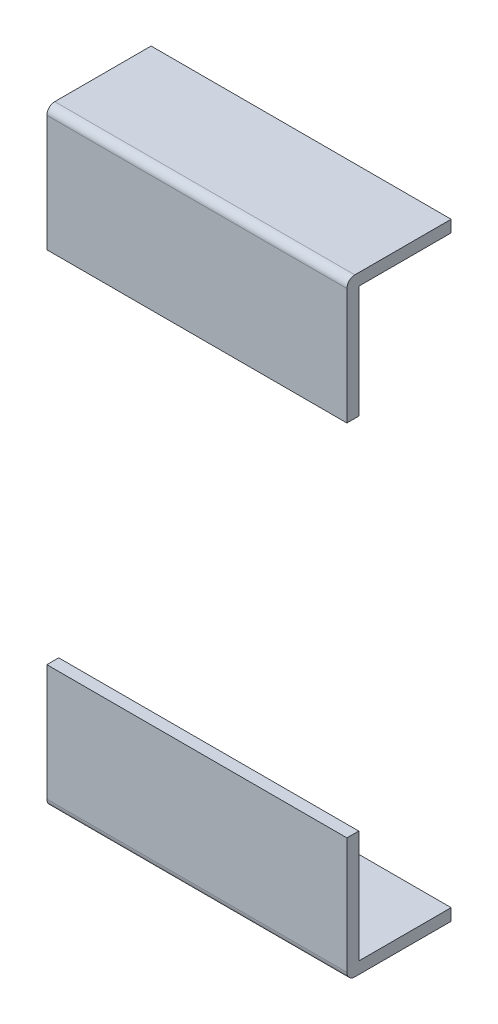
ISO-10303-21;
HEADER;
FILE_DESCRIPTION(('STEP AP214'),'2;1');
FILE_NAME('part.step','',(''),(''),'','','');
FILE_SCHEMA(('AUTOMOTIVE_DESIGN { 1 0 10303 214 1 1 1 1 }'));
ENDSEC;
DATA;
#1=APPLICATION_CONTEXT('core data for automotive mechanical design processes');
#2=APPLICATION_PROTOCOL_DEFINITION('international standard','automotive_design',2000,#1);
#3=PRODUCT_CONTEXT('',#1,'mechanical');
#4=PRODUCT('Part','Part','',(#3));
#5=PRODUCT_RELATED_PRODUCT_CATEGORY('part','',(#4));
#6=PRODUCT_DEFINITION_FORMATION('','',#4);
#7=PRODUCT_DEFINITION_CONTEXT('part definition',#1,'design');
#8=PRODUCT_DEFINITION('design','',#6,#7);
#9=PRODUCT_DEFINITION_SHAPE('','',#8);
#10=(LENGTH_UNIT() NAMED_UNIT(*) SI_UNIT(.MILLI.,.METRE.));
#11=(NAMED_UNIT(*) PLANE_ANGLE_UNIT() SI_UNIT($,.RADIAN.));
#12=(NAMED_UNIT(*) SI_UNIT($,.STERADIAN.) SOLID_ANGLE_UNIT());
#13=UNCERTAINTY_MEASURE_WITH_UNIT(LENGTH_MEASURE(1.E-05),#10,'distance_accuracy_value','');
#14=(GEOMETRIC_REPRESENTATION_CONTEXT(3) GLOBAL_UNCERTAINTY_ASSIGNED_CONTEXT((#13)) GLOBAL_UNIT_ASSIGNED_CONTEXT((#10,
#11,#12)) REPRESENTATION_CONTEXT('',''));
#15=CARTESIAN_POINT('',(0.,0.,0.));
#16=DIRECTION('',(0.,0.,1.));
#17=DIRECTION('',(1.,0.,0.));
#18=AXIS2_PLACEMENT_3D('',#15,#16,#17);
#19=CARTESIAN_POINT('',(59.620001155307,70.760000196981,-1.636522106092));
#20=DIRECTION('',(0.,4.371138828674E-08,-0.999999999999999));
#21=DIRECTION('',(0.,0.999999999999999,4.371138828674E-08));
#22=AXIS2_PLACEMENT_3D('',#19,#20,#21);
#23=PLANE('',#22);
#24=DIRECTION('',(8.74227765734797E-08,0.999999999999996,0.));
#25=VECTOR('',#24,1.);
#26=CARTESIAN_POINT('',(54.620001286441,72.260000674309,-1.636522106092));
#27=LINE('',#26,#25);
#28=CARTESIAN_POINT('',(54.6200011553069,70.7600006409135,-1.63652210609199));
#29=VERTEX_POINT('',#28);
#30=CARTESIAN_POINT('',(54.6200011802228,71.0450006340947,-1.63652209778667));
#31=VERTEX_POINT('',#30);
#32=EDGE_CURVE('P0_E89',#29,#31,#27,.T.);
#33=ORIENTED_EDGE('',*,*,#32,.T.);
#34=DIRECTION('',(0.999999999999996,-8.74227765734797E-08,0.));
#35=VECTOR('',#34,1.);
#36=CARTESIAN_POINT('',(55.380001180223,71.0450005676532,-1.636522093634));
#37=LINE('',#36,#35);
#38=CARTESIAN_POINT('',(55.3800011802225,71.0450005667791,-1.636522093634));
#39=VERTEX_POINT('',#38);
#40=EDGE_CURVE('P0_E92',#31,#39,#37,.T.);
#41=ORIENTED_EDGE('',*,*,#40,.T.);
#42=DIRECTION('',(-8.74227765734797E-08,-0.999999999999996,0.));
#43=VECTOR('',#42,1.);
#44=CARTESIAN_POINT('',(55.380001286441,72.260000607868,-1.636522093634));
#45=LINE('',#44,#43);
#46=CARTESIAN_POINT('',(55.3800011553068,70.7600005676537,-1.63652209778667));
#47=VERTEX_POINT('',#46);
#48=EDGE_CURVE('P0_E94',#39,#47,#45,.T.);
#49=ORIENTED_EDGE('',*,*,#48,.T.);
#50=DIRECTION('',(-0.999999999999996,8.74227765734797E-08,0.));
#51=VECTOR('',#50,1.);
#52=CARTESIAN_POINT('',(59.620001155307,70.7600001969805,-1.636522106092));
#53=LINE('',#52,#51);
#54=EDGE_CURVE('P0_E86',#29,#47,#53,.F.);
#55=ORIENTED_EDGE('',*,*,#54,.F.);
#56=EDGE_LOOP('',(#33,#41,#49,#55));
#57=FACE_BOUND('',#56,.T.);
#58=ADVANCED_FACE('P0_F17',(#57),#23,.T.);
#59=CARTESIAN_POINT('',(59.620001155307,70.760000207209,-1.870522106092));
#60=DIRECTION('',(8.74227765734796E-08,0.999999999999995,4.37113882867398E-08));
#61=DIRECTION('',(-0.999999999999996,8.74227765734797E-08,0.));
#62=AXIS2_PLACEMENT_3D('',#59,#60,#61);
#63=PLANE('',#62);
#64=DIRECTION('',(0.,0.,1.));
#65=VECTOR('',#64,1.);
#66=CARTESIAN_POINT('',(54.6200011553068,70.760000644323,-2.556522040525));
#67=LINE('',#66,#65);
#68=CARTESIAN_POINT('',(54.6200011544326,70.760000644323,-1.87052210696611));
#69=VERTEX_POINT('',#68);
#70=EDGE_CURVE('P0_E158',#69,#29,#67,.T.);
#71=ORIENTED_EDGE('',*,*,#70,.T.);
#72=ORIENTED_EDGE('',*,*,#54,.T.);
#73=DIRECTION('',(0.,0.,1.));
#74=VECTOR('',#73,1.);
#75=CARTESIAN_POINT('',(55.3800011553068,70.760000567654,-2.556522040525));
#76=LINE('',#75,#74);
#77=CARTESIAN_POINT('',(55.3800011553068,70.7600005932103,-1.87052210609211));
#78=VERTEX_POINT('',#77);
#79=EDGE_CURVE('P0_E108',#47,#78,#76,.F.);
#80=ORIENTED_EDGE('',*,*,#79,.T.);
#81=DIRECTION('',(1.,0.,0.));
#82=VECTOR('',#81,1.);
#83=CARTESIAN_POINT('',(55.000001153996,70.760000644323,-1.87052210609233));
#84=LINE('',#83,#82);
#85=EDGE_CURVE('P0_E135',#69,#78,#84,.T.);
#86=ORIENTED_EDGE('',*,*,#85,.F.);
#87=EDGE_LOOP('',(#71,#72,#80,#86));
#88=FACE_BOUND('',#87,.T.);
#89=ADVANCED_FACE('P0_F179',(#88),#63,.T.);
#90=CARTESIAN_POINT('',(55.000001153996,70.745000611103,-1.870522106748));
#91=DIRECTION('',(0.,4.371138828674E-08,-0.999999999999999));
#92=DIRECTION('',(0.,0.999999999999999,4.371138828674E-08));
#93=AXIS2_PLACEMENT_3D('',#90,#91,#92);
#94=PLANE('',#93);
#95=DIRECTION('',(8.74227765734797E-08,0.999999999999996,0.));
#96=VECTOR('',#95,1.);
#97=CARTESIAN_POINT('',(54.620001286441,72.260000674309,-1.870522107403));
#98=LINE('',#97,#96);
#99=CARTESIAN_POINT('',(54.6200011526841,70.7300006372131,-1.870522107403));
#100=VERTEX_POINT('',#99);
#101=EDGE_CURVE('P0_E130',#100,#69,#98,.T.);
#102=ORIENTED_EDGE('',*,*,#101,.T.);
#103=ORIENTED_EDGE('',*,*,#85,.T.);
#104=DIRECTION('',(-8.74227765734797E-08,-0.999999999999996,0.));
#105=VECTOR('',#104,1.);
#106=CARTESIAN_POINT('',(55.380001286441,72.260000607868,-1.870522106092));
#107=LINE('',#106,#105);
#108=CARTESIAN_POINT('',(55.3800011526842,70.7300005778819,-1.870522106529));
#109=VERTEX_POINT('',#108);
#110=EDGE_CURVE('P0_E138',#78,#109,#107,.T.);
#111=ORIENTED_EDGE('',*,*,#110,.T.);
#112=DIRECTION('',(-0.999999999999996,8.74227765734797E-08,0.));
#113=VECTOR('',#112,1.);
#114=CARTESIAN_POINT('',(55.380001152684,70.7300005778818,-1.870522107403));
#115=LINE('',#114,#113);
#116=EDGE_CURVE('P0_E66',#109,#100,#115,.T.);
#117=ORIENTED_EDGE('',*,*,#116,.T.);
#118=EDGE_LOOP('',(#102,#103,#111,#117));
#119=FACE_BOUND('',#118,.T.);
#120=ADVANCED_FACE('P0_F169',(#119),#94,.T.);
#121=CARTESIAN_POINT('',(55.380001152684,70.730000566342,-1.606522107403));
#122=DIRECTION('',(8.74227765734796E-08,0.999999999999995,4.37113882867398E-08));
#123=DIRECTION('',(-0.999999999999996,8.74227765734797E-08,0.));
#124=AXIS2_PLACEMENT_3D('',#121,#122,#123);
#125=PLANE('',#124);
#126=DIRECTION('',(0.,0.,1.));
#127=VECTOR('',#126,1.);
#128=CARTESIAN_POINT('',(54.6200011526842,70.730000633658,-2.556522040525));
#129=LINE('',#128,#127);
#130=CARTESIAN_POINT('',(54.6200011526845,70.7300006336577,-1.62652210652899));
#131=VERTEX_POINT('',#130);
#132=EDGE_CURVE('P0_E60',#131,#100,#129,.F.);
#133=ORIENTED_EDGE('',*,*,#132,.T.);
#134=ORIENTED_EDGE('',*,*,#116,.F.);
#135=DIRECTION('',(0.,0.,1.));
#136=VECTOR('',#135,1.);
#137=CARTESIAN_POINT('',(55.3800011526842,70.730000577882,-2.556522040525));
#138=LINE('',#137,#136);
#139=CARTESIAN_POINT('',(55.380001152684,70.730000572549,-1.626522106529));
#140=VERTEX_POINT('',#139);
#141=EDGE_CURVE('P0_E141',#109,#140,#138,.T.);
#142=ORIENTED_EDGE('',*,*,#141,.T.);
#143=DIRECTION('',(-0.999999999999996,8.74227765734797E-08,0.));
#144=VECTOR('',#143,1.);
#145=CARTESIAN_POINT('',(55.3800011526845,70.730000567216,-1.626522106529));
#146=LINE('',#145,#144);
#147=EDGE_CURVE('P0_E53',#131,#140,#146,.F.);
#148=ORIENTED_EDGE('',*,*,#147,.F.);
#149=EDGE_LOOP('',(#133,#134,#142,#148));
#150=FACE_BOUND('',#149,.T.);
#151=ADVANCED_FACE('P0_F172',(#150),#125,.F.);
#152=CARTESIAN_POINT('',(54.620001286441,72.260000674309,-2.556522040525));
#153=DIRECTION('',(0.999999999999996,-8.74227765734797E-08,0.));
#154=DIRECTION('',(8.74227765734797E-08,0.999999999999996,0.));
#155=AXIS2_PLACEMENT_3D('',#152,#153,#154);
#156=PLANE('',#155);
#157=DIRECTION('',(0.,0.999999999999999,4.371138828674E-08));
#158=VECTOR('',#157,1.);
#159=CARTESIAN_POINT('',(54.620001154433,70.730000566342,-1.606522107403));
#160=LINE('',#159,#158);
#161=CARTESIAN_POINT('',(54.620001154433,70.7500005829523,-1.6065221065289));
#162=VERTEX_POINT('',#161);
#163=CARTESIAN_POINT('',(54.6200011630297,71.0450006327837,-1.60652209363391));
#164=VERTEX_POINT('',#163);
#165=EDGE_CURVE('P0_E47',#162,#164,#160,.T.);
#166=ORIENTED_EDGE('',*,*,#165,.T.);
#167=DIRECTION('',(0.,-4.37113882867396E-08,0.999999999999999));
#168=VECTOR('',#167,1.);
#169=CARTESIAN_POINT('',(54.620001180223,71.0450006332203,-1.616522093634));
#170=LINE('',#169,#168);
#171=EDGE_CURVE('P0_E99',#164,#31,#170,.F.);
#172=ORIENTED_EDGE('',*,*,#171,.T.);
#173=ORIENTED_EDGE('',*,*,#32,.F.);
#174=ORIENTED_EDGE('',*,*,#70,.F.);
#175=ORIENTED_EDGE('',*,*,#101,.F.);
#176=ORIENTED_EDGE('',*,*,#132,.F.);
#177=CARTESIAN_POINT('',(54.620001154433,70.7500006336573,-1.62652210652899));
#178=DIRECTION('',(-0.999999999999996,8.74227765734797E-08,0.));
#179=DIRECTION('',(-8.74227765734797E-08,-0.999999999999996,0.));
#180=AXIS2_PLACEMENT_3D('',#177,#178,#179);
#181=CIRCLE('',#180,0.02);
#182=EDGE_CURVE('P0_E20',#162,#131,#181,.F.);
#183=ORIENTED_EDGE('',*,*,#182,.F.);
#184=EDGE_LOOP('',(#166,#172,#173,#174,#175,#176,#183));
#185=FACE_BOUND('',#184,.T.);
#186=ADVANCED_FACE('P0_F171',(#185),#156,.F.);
#187=CARTESIAN_POINT('',(55.380001180223,71.045000566779,-1.616522093634));
#188=DIRECTION('',(-8.74227765734796E-08,-0.999999999999995,-4.37113882867398E-08));
#189=DIRECTION('',(0.999999999999996,-8.74227765734797E-08,0.));
#190=AXIS2_PLACEMENT_3D('',#187,#188,#189);
#191=PLANE('',#190);
#192=ORIENTED_EDGE('',*,*,#40,.F.);
#193=ORIENTED_EDGE('',*,*,#171,.F.);
#194=DIRECTION('',(1.,0.,0.));
#195=VECTOR('',#194,1.);
#196=CARTESIAN_POINT('',(55.380001152684,71.045000632784,-1.60652209363391));
#197=LINE('',#196,#195);
#198=CARTESIAN_POINT('',(55.3800011802228,71.045000599563,-1.60652209363391));
#199=VERTEX_POINT('',#198);
#200=EDGE_CURVE('P0_E112',#164,#199,#197,.T.);
#201=ORIENTED_EDGE('',*,*,#200,.T.);
#202=DIRECTION('',(0.,0.,1.));
#203=VECTOR('',#202,1.);
#204=CARTESIAN_POINT('',(55.3800011802223,71.045000566342,-2.556522040525));
#205=LINE('',#204,#203);
#206=EDGE_CURVE('P0_E98',#199,#39,#205,.F.);
#207=ORIENTED_EDGE('',*,*,#206,.T.);
#208=EDGE_LOOP('',(#192,#193,#201,#207));
#209=FACE_BOUND('',#208,.T.);
#210=ADVANCED_FACE('P0_F111',(#209),#191,.F.);
#211=CARTESIAN_POINT('',(55.380001286441,72.260000607868,-2.556522040525));
#212=DIRECTION('',(-0.999999999999996,8.74227765734797E-08,0.));
#213=DIRECTION('',(-8.74227765734797E-08,-0.999999999999996,0.));
#214=AXIS2_PLACEMENT_3D('',#211,#212,#213);
#215=PLANE('',#214);
#216=ORIENTED_EDGE('',*,*,#141,.F.);
#217=ORIENTED_EDGE('',*,*,#110,.F.);
#218=ORIENTED_EDGE('',*,*,#79,.F.);
#219=ORIENTED_EDGE('',*,*,#48,.F.);
#220=ORIENTED_EDGE('',*,*,#206,.F.);
#221=DIRECTION('',(0.,0.999999999999999,4.371138828674E-08));
#222=VECTOR('',#221,1.);
#223=CARTESIAN_POINT('',(55.380001180223,70.730000566342,-1.606522107403));
#224=LINE('',#223,#222);
#225=CARTESIAN_POINT('',(55.3800011673277,70.750000566342,-1.60652210652889));
#226=VERTEX_POINT('',#225);
#227=EDGE_CURVE('P0_E26',#199,#226,#224,.F.);
#228=ORIENTED_EDGE('',*,*,#227,.T.);
#229=CARTESIAN_POINT('',(55.3800011544325,70.750000567216,-1.626522106529));
#230=DIRECTION('',(-0.999999999999996,8.74227765734797E-08,0.));
#231=DIRECTION('',(-8.74227765734797E-08,-0.999999999999996,0.));
#232=AXIS2_PLACEMENT_3D('',#229,#230,#231);
#233=CIRCLE('',#232,0.02);
#234=EDGE_CURVE('P0_E34',#140,#226,#233,.T.);
#235=ORIENTED_EDGE('',*,*,#234,.F.);
#236=EDGE_LOOP('',(#216,#217,#218,#219,#220,#228,#235));
#237=FACE_BOUND('',#236,.T.);
#238=ADVANCED_FACE('P0_F103',(#237),#215,.F.);
#239=CARTESIAN_POINT('',(55.380001154433,70.750000567216,-1.626522106529));
#240=DIRECTION('',(-0.999999999999996,8.74227765734797E-08,0.));
#241=DIRECTION('',(-8.74227765734797E-08,-0.999999999999996,0.));
#242=AXIS2_PLACEMENT_3D('',#239,#240,#241);
#243=CYLINDRICAL_SURFACE('',#242,0.02);
#244=ORIENTED_EDGE('',*,*,#147,.T.);
#245=ORIENTED_EDGE('',*,*,#234,.T.);
#246=DIRECTION('',(1.,0.,0.));
#247=VECTOR('',#246,1.);
#248=CARTESIAN_POINT('',(55.380001152684,70.750000566342,-1.60652210652877));
#249=LINE('',#248,#247);
#250=EDGE_CURVE('P0_E11',#226,#162,#249,.F.);
#251=ORIENTED_EDGE('',*,*,#250,.T.);
#252=ORIENTED_EDGE('',*,*,#182,.T.);
#253=EDGE_LOOP('',(#244,#245,#251,#252));
#254=FACE_BOUND('',#253,.T.);
#255=ADVANCED_FACE('P0_F177',(#254),#243,.T.);
#256=CARTESIAN_POINT('',(55.380001152684,70.730000566342,-1.606522107403));
#257=DIRECTION('',(0.,4.371138828674E-08,-0.999999999999999));
#258=DIRECTION('',(0.,0.999999999999999,4.371138828674E-08));
#259=AXIS2_PLACEMENT_3D('',#256,#257,#258);
#260=PLANE('',#259);
#261=ORIENTED_EDGE('',*,*,#227,.F.);
#262=ORIENTED_EDGE('',*,*,#200,.F.);
#263=ORIENTED_EDGE('',*,*,#165,.F.);
#264=ORIENTED_EDGE('',*,*,#250,.F.);
#265=EDGE_LOOP('',(#261,#262,#263,#264));
#266=FACE_BOUND('',#265,.T.);
#267=ADVANCED_FACE('P0_F176',(#266),#260,.F.);
#268=CLOSED_SHELL('',(#58,#89,#120,#151,#186,#210,#238,#255,#267));
#269=MANIFOLD_SOLID_BREP('P0_B1',#268);
#270=CARTESIAN_POINT('',(55.000001286004,72.255000611103,-1.870522040744));
#271=DIRECTION('',(0.,4.371138828674E-08,-0.999999999999999));
#272=DIRECTION('',(0.,0.999999999999999,4.371138828674E-08));
#273=AXIS2_PLACEMENT_3D('',#270,#271,#272);
#274=PLANE('',#273);
#275=DIRECTION('',(8.74227765734797E-08,0.999999999999996,0.));
#276=VECTOR('',#275,1.);
#277=CARTESIAN_POINT('',(54.620001286441,72.260000674309,-1.870522041399));
#278=LINE('',#277,#276);
#279=CARTESIAN_POINT('',(54.6200012846927,72.2400006375045,-1.87052204139911));
#280=VERTEX_POINT('',#279);
#281=CARTESIAN_POINT('',(54.6200012873155,72.2700006443231,-1.870522040962));
#282=VERTEX_POINT('',#281);
#283=EDGE_CURVE('P1_E130',#280,#282,#278,.T.);
#284=ORIENTED_EDGE('',*,*,#283,.T.);
#285=DIRECTION('',(0.999999999999996,-8.74227765734797E-08,0.));
#286=VECTOR('',#285,1.);
#287=CARTESIAN_POINT('',(55.380001287316,72.2700005778818,-1.870522040088));
#288=LINE('',#287,#286);
#289=CARTESIAN_POINT('',(55.3800012873155,72.2700005707713,-1.870522040088));
#290=VERTEX_POINT('',#289);
#291=EDGE_CURVE('P1_E91',#282,#290,#288,.T.);
#292=ORIENTED_EDGE('',*,*,#291,.T.);
#293=DIRECTION('',(-8.74227765734797E-08,-0.999999999999996,0.));
#294=VECTOR('',#293,1.);
#295=CARTESIAN_POINT('',(55.380001286441,72.260000607868,-1.870522040088));
#296=LINE('',#295,#294);
#297=CARTESIAN_POINT('',(55.3800012846926,72.240000577882,-1.870522040525));
#298=VERTEX_POINT('',#297);
#299=EDGE_CURVE('P1_E87',#290,#298,#296,.T.);
#300=ORIENTED_EDGE('',*,*,#299,.T.);
#301=DIRECTION('',(0.999999999999996,-8.74227765734797E-08,0.));
#302=VECTOR('',#301,1.);
#303=CARTESIAN_POINT('',(59.620001284693,72.2400002072095,-1.870522041399));
#304=LINE('',#303,#302);
#305=EDGE_CURVE('P1_E89',#280,#298,#304,.T.);
#306=ORIENTED_EDGE('',*,*,#305,.F.);
#307=EDGE_LOOP('',(#284,#292,#300,#306));
#308=FACE_BOUND('',#307,.T.);
#309=ADVANCED_FACE('P1_F17',(#308),#274,.T.);
#310=CARTESIAN_POINT('',(59.620001284693,72.240000196981,-1.636522041399));
#311=DIRECTION('',(-8.74227765734796E-08,-0.999999999999995,-4.37113882867398E-08));
#312=DIRECTION('',(0.999999999999996,-8.74227765734797E-08,0.));
#313=AXIS2_PLACEMENT_3D('',#310,#311,#312);
#314=PLANE('',#313);
#315=DIRECTION('',(0.,0.,1.));
#316=VECTOR('',#315,1.);
#317=CARTESIAN_POINT('',(54.6200012846925,72.240000634095,-2.556522040525));
#318=LINE('',#317,#316);
#319=CARTESIAN_POINT('',(54.6200012763874,72.240000634095,-1.63652204970437));
#320=VERTEX_POINT('',#319);
#321=EDGE_CURVE('P1_E101',#320,#280,#318,.F.);
#322=ORIENTED_EDGE('',*,*,#321,.T.);
#323=ORIENTED_EDGE('',*,*,#305,.T.);
#324=DIRECTION('',(0.,0.,1.));
#325=VECTOR('',#324,1.);
#326=CARTESIAN_POINT('',(55.3800012846925,72.240000577882,-2.556522040525));
#327=LINE('',#326,#325);
#328=CARTESIAN_POINT('',(55.3800012846926,72.2400005966197,-1.63652204139904));
#329=VERTEX_POINT('',#328);
#330=EDGE_CURVE('P1_E94',#298,#329,#327,.T.);
#331=ORIENTED_EDGE('',*,*,#330,.T.);
#332=DIRECTION('',(1.,0.,0.));
#333=VECTOR('',#332,1.);
#334=CARTESIAN_POINT('',(59.620001155307,72.240000634095,-1.63652204139913));
#335=LINE('',#334,#333);
#336=EDGE_CURVE('P1_E103',#320,#329,#335,.T.);
#337=ORIENTED_EDGE('',*,*,#336,.F.);
#338=EDGE_LOOP('',(#322,#323,#331,#337));
#339=FACE_BOUND('',#338,.T.);
#340=ADVANCED_FACE('P1_F98',(#339),#314,.T.);
#341=CARTESIAN_POINT('',(59.620001155307,70.760000196981,-1.636522106092));
#342=DIRECTION('',(0.,4.371138828674E-08,-0.999999999999999));
#343=DIRECTION('',(0.,0.999999999999999,4.371138828674E-08));
#344=AXIS2_PLACEMENT_3D('',#341,#342,#343);
#345=PLANE('',#344);
#346=DIRECTION('',(-0.999999999999996,8.74227765734797E-08,0.));
#347=VECTOR('',#346,1.);
#348=CARTESIAN_POINT('',(55.380001259777,71.9550005676532,-1.636522053857));
#349=LINE('',#348,#347);
#350=CARTESIAN_POINT('',(55.3800012597771,71.9550005676537,-1.63652204555167));
#351=VERTEX_POINT('',#350);
#352=CARTESIAN_POINT('',(54.620001259777,71.9550006340945,-1.636522053857));
#353=VERTEX_POINT('',#352);
#354=EDGE_CURVE('P1_E147',#351,#353,#349,.T.);
#355=ORIENTED_EDGE('',*,*,#354,.T.);
#356=DIRECTION('',(8.74227765734797E-08,0.999999999999996,0.));
#357=VECTOR('',#356,1.);
#358=CARTESIAN_POINT('',(54.620001286441,72.260000674309,-1.636522053857));
#359=LINE('',#358,#357);
#360=EDGE_CURVE('P1_E123',#353,#320,#359,.T.);
#361=ORIENTED_EDGE('',*,*,#360,.T.);
#362=ORIENTED_EDGE('',*,*,#336,.T.);
#363=DIRECTION('',(-8.74227765734797E-08,-0.999999999999996,0.));
#364=VECTOR('',#363,1.);
#365=CARTESIAN_POINT('',(55.380001286441,72.260000607868,-1.636522041399));
#366=LINE('',#365,#364);
#367=EDGE_CURVE('P1_E108',#329,#351,#366,.T.);
#368=ORIENTED_EDGE('',*,*,#367,.T.);
#369=EDGE_LOOP('',(#355,#361,#362,#368));
#370=FACE_BOUND('',#369,.T.);
#371=ADVANCED_FACE('P1_F153',(#370),#345,.T.);
#372=CARTESIAN_POINT('',(55.380001287316,72.270000566342,-1.606522040088));
#373=DIRECTION('',(-8.74227765734796E-08,-0.999999999999995,-4.37113882867398E-08));
#374=DIRECTION('',(0.999999999999996,-8.74227765734797E-08,0.));
#375=AXIS2_PLACEMENT_3D('',#372,#373,#374);
#376=PLANE('',#375);
#377=DIRECTION('',(0.,0.,1.));
#378=VECTOR('',#377,1.);
#379=CARTESIAN_POINT('',(55.3800012873152,72.270000567216,-2.556522040525));
#380=LINE('',#379,#378);
#381=CARTESIAN_POINT('',(55.3800012873153,72.270000567216,-1.626522040525));
#382=VERTEX_POINT('',#381);
#383=EDGE_CURVE('P1_E95',#382,#290,#380,.F.);
#384=ORIENTED_EDGE('',*,*,#383,.T.);
#385=ORIENTED_EDGE('',*,*,#291,.F.);
#386=DIRECTION('',(0.,0.,1.));
#387=VECTOR('',#386,1.);
#388=CARTESIAN_POINT('',(54.6200012873152,72.270000644323,-2.556522040525));
#389=LINE('',#388,#387);
#390=CARTESIAN_POINT('',(54.620001287316,72.2700006389902,-1.62652204052499));
#391=VERTEX_POINT('',#390);
#392=EDGE_CURVE('P1_E52',#282,#391,#389,.T.);
#393=ORIENTED_EDGE('',*,*,#392,.T.);
#394=DIRECTION('',(-0.999999999999996,8.74227765734797E-08,0.));
#395=VECTOR('',#394,1.);
#396=CARTESIAN_POINT('',(55.3800012873155,72.270000567216,-1.626522040088));
#397=LINE('',#396,#395);
#398=EDGE_CURVE('P1_E140',#382,#391,#397,.T.);
#399=ORIENTED_EDGE('',*,*,#398,.F.);
#400=EDGE_LOOP('',(#384,#385,#393,#399));
#401=FACE_BOUND('',#400,.T.);
#402=ADVANCED_FACE('P1_F156',(#401),#376,.F.);
#403=CARTESIAN_POINT('',(54.620001286441,72.260000674309,-2.556522040525));
#404=DIRECTION('',(0.999999999999996,-8.74227765734797E-08,0.));
#405=DIRECTION('',(8.74227765734797E-08,0.999999999999996,0.));
#406=AXIS2_PLACEMENT_3D('',#403,#404,#405);
#407=PLANE('',#406);
#408=ORIENTED_EDGE('',*,*,#392,.F.);
#409=ORIENTED_EDGE('',*,*,#283,.F.);
#410=ORIENTED_EDGE('',*,*,#321,.F.);
#411=ORIENTED_EDGE('',*,*,#360,.F.);
#412=DIRECTION('',(0.,-4.37113882867396E-08,0.999999999999999));
#413=VECTOR('',#412,1.);
#414=CARTESIAN_POINT('',(54.620001259777,71.9550006332203,-1.616522053857));
#415=LINE('',#414,#413);
#416=CARTESIAN_POINT('',(54.6200012769703,71.9550006327838,-1.60652205385708));
#417=VERTEX_POINT('',#416);
#418=EDGE_CURVE('P1_E63',#353,#417,#415,.T.);
#419=ORIENTED_EDGE('',*,*,#418,.T.);
#420=DIRECTION('',(0.,-0.999999999999999,-4.371138828674E-08));
#421=VECTOR('',#420,1.);
#422=CARTESIAN_POINT('',(54.620001285567,72.270000566342,-1.606522040088));
#423=LINE('',#422,#421);
#424=CARTESIAN_POINT('',(54.6200012855673,72.2500005829525,-1.60652204096212));
#425=VERTEX_POINT('',#424);
#426=EDGE_CURVE('P1_E58',#425,#417,#423,.T.);
#427=ORIENTED_EDGE('',*,*,#426,.F.);
#428=CARTESIAN_POINT('',(54.6200012855675,72.2500006336573,-1.62652204096199));
#429=DIRECTION('',(-0.999999999999996,8.74227765734797E-08,0.));
#430=DIRECTION('',(-8.74227765734797E-08,-0.999999999999996,0.));
#431=AXIS2_PLACEMENT_3D('',#428,#429,#430);
#432=CIRCLE('',#431,0.02);
#433=EDGE_CURVE('P1_E20',#391,#425,#432,.F.);
#434=ORIENTED_EDGE('',*,*,#433,.F.);
#435=EDGE_LOOP('',(#408,#409,#410,#411,#419,#427,#434));
#436=FACE_BOUND('',#435,.T.);
#437=ADVANCED_FACE('P1_F155',(#436),#407,.F.);
#438=CARTESIAN_POINT('',(55.380001259777,71.955000566779,-1.616522053857));
#439=DIRECTION('',(8.74227765734796E-08,0.999999999999995,4.37113882867398E-08));
#440=DIRECTION('',(-0.999999999999996,8.74227765734797E-08,0.));
#441=AXIS2_PLACEMENT_3D('',#438,#439,#440);
#442=PLANE('',#441);
#443=ORIENTED_EDGE('',*,*,#354,.F.);
#444=DIRECTION('',(0.,0.,1.));
#445=VECTOR('',#444,1.);
#446=CARTESIAN_POINT('',(55.3800012597771,71.955000567654,-2.556522040525));
#447=LINE('',#446,#445);
#448=CARTESIAN_POINT('',(55.380001259777,71.955000600219,-1.60652205385709));
#449=VERTEX_POINT('',#448);
#450=EDGE_CURVE('P1_E110',#351,#449,#447,.T.);
#451=ORIENTED_EDGE('',*,*,#450,.T.);
#452=DIRECTION('',(1.,0.,0.));
#453=VECTOR('',#452,1.);
#454=CARTESIAN_POINT('',(55.380001287316,71.955000632784,-1.60652205385708));
#455=LINE('',#454,#453);
#456=EDGE_CURVE('P1_E138',#417,#449,#455,.T.);
#457=ORIENTED_EDGE('',*,*,#456,.F.);
#458=ORIENTED_EDGE('',*,*,#418,.F.);
#459=EDGE_LOOP('',(#443,#451,#457,#458));
#460=FACE_BOUND('',#459,.T.);
#461=ADVANCED_FACE('P1_F178',(#460),#442,.F.);
#462=CARTESIAN_POINT('',(55.380001286441,72.260000607868,-2.556522040525));
#463=DIRECTION('',(-0.999999999999996,8.74227765734797E-08,0.));
#464=DIRECTION('',(-8.74227765734797E-08,-0.999999999999996,0.));
#465=AXIS2_PLACEMENT_3D('',#462,#463,#464);
#466=PLANE('',#465);
#467=DIRECTION('',(0.,-0.999999999999999,-4.371138828674E-08));
#468=VECTOR('',#467,1.);
#469=CARTESIAN_POINT('',(55.380001259777,72.270000566342,-1.606522040088));
#470=LINE('',#469,#468);
#471=CARTESIAN_POINT('',(55.380001272672,72.2500005663422,-1.60652204096211));
#472=VERTEX_POINT('',#471);
#473=EDGE_CURVE('P1_E26',#449,#472,#470,.F.);
#474=ORIENTED_EDGE('',*,*,#473,.F.);
#475=ORIENTED_EDGE('',*,*,#450,.F.);
#476=ORIENTED_EDGE('',*,*,#367,.F.);
#477=ORIENTED_EDGE('',*,*,#330,.F.);
#478=ORIENTED_EDGE('',*,*,#299,.F.);
#479=ORIENTED_EDGE('',*,*,#383,.F.);
#480=CARTESIAN_POINT('',(55.380001285567,72.250000567216,-1.626522040962));
#481=DIRECTION('',(-0.999999999999996,8.74227765734797E-08,0.));
#482=DIRECTION('',(-8.74227765734797E-08,-0.999999999999996,0.));
#483=AXIS2_PLACEMENT_3D('',#480,#481,#482);
#484=CIRCLE('',#483,0.02);
#485=EDGE_CURVE('P1_E35',#472,#382,#484,.T.);
#486=ORIENTED_EDGE('',*,*,#485,.F.);
#487=EDGE_LOOP('',(#474,#475,#476,#477,#478,#479,#486));
#488=FACE_BOUND('',#487,.T.);
#489=ADVANCED_FACE('P1_F106',(#488),#466,.F.);
#490=CARTESIAN_POINT('',(55.380001285567,72.250000567216,-1.626522040962));
#491=DIRECTION('',(-0.999999999999996,8.74227765734797E-08,0.));
#492=DIRECTION('',(-8.74227765734797E-08,-0.999999999999996,0.));
#493=AXIS2_PLACEMENT_3D('',#490,#491,#492);
#494=CYLINDRICAL_SURFACE('',#493,0.02);
#495=DIRECTION('',(1.,0.,0.));
#496=VECTOR('',#495,1.);
#497=CARTESIAN_POINT('',(55.380001287316,72.250000566342,-1.60652204096223));
#498=LINE('',#497,#496);
#499=EDGE_CURVE('P1_E11',#472,#425,#498,.F.);
#500=ORIENTED_EDGE('',*,*,#499,.F.);
#501=ORIENTED_EDGE('',*,*,#485,.T.);
#502=ORIENTED_EDGE('',*,*,#398,.T.);
#503=ORIENTED_EDGE('',*,*,#433,.T.);
#504=EDGE_LOOP('',(#500,#501,#502,#503));
#505=FACE_BOUND('',#504,.T.);
#506=ADVANCED_FACE('P1_F186',(#505),#494,.T.);
#507=CARTESIAN_POINT('',(55.380001287316,72.270000566342,-1.606522040088));
#508=DIRECTION('',(0.,-4.371138828674E-08,0.999999999999999));
#509=DIRECTION('',(0.,-0.999999999999999,-4.371138828674E-08));
#510=AXIS2_PLACEMENT_3D('',#507,#508,#509);
#511=PLANE('',#510);
#512=ORIENTED_EDGE('',*,*,#473,.T.);
#513=ORIENTED_EDGE('',*,*,#499,.T.);
#514=ORIENTED_EDGE('',*,*,#426,.T.);
#515=ORIENTED_EDGE('',*,*,#456,.T.);
#516=EDGE_LOOP('',(#512,#513,#514,#515));
#517=FACE_BOUND('',#516,.T.);
#518=ADVANCED_FACE('P1_F176',(#517),#511,.T.);
#519=CLOSED_SHELL('',(#309,#340,#371,#402,#437,#461,#489,#506,#518));
#520=MANIFOLD_SOLID_BREP('P1_B1',#519);
#521=ADVANCED_BREP_SHAPE_REPRESENTATION('',(#18,#269,#520),#14);
#522=SHAPE_DEFINITION_REPRESENTATION(#9,#521);
ENDSEC;
END-ISO-10303-21;
